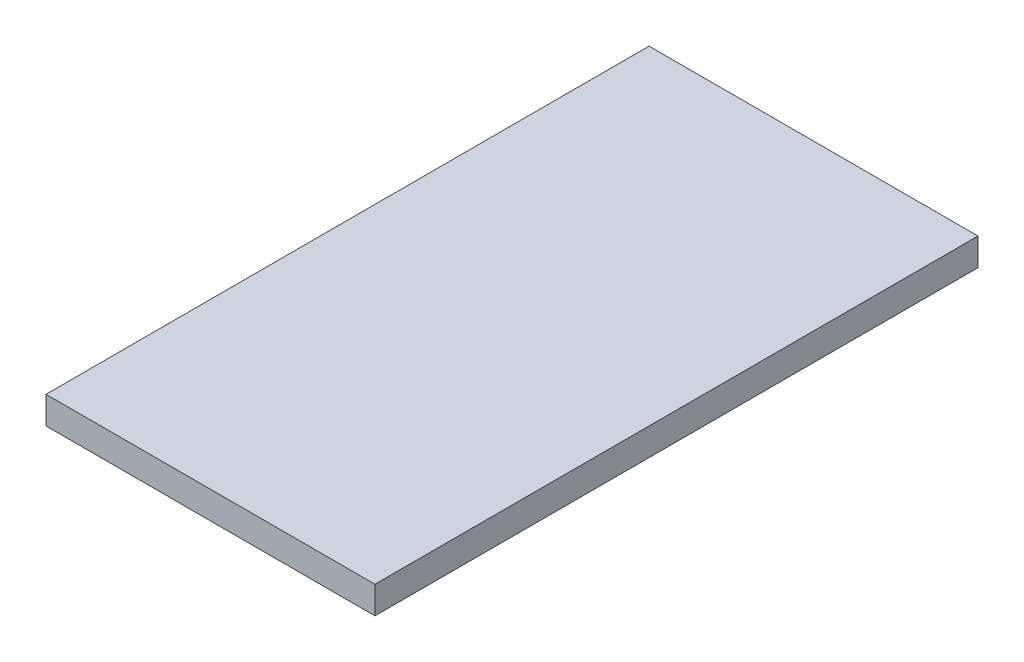
ISO-10303-21;
HEADER;
FILE_DESCRIPTION(('STEP AP214'),'2;1');
FILE_NAME('part.step','',(''),(''),'','','');
FILE_SCHEMA(('AUTOMOTIVE_DESIGN { 1 0 10303 214 1 1 1 1 }'));
ENDSEC;
DATA;
#1=APPLICATION_CONTEXT('core data for automotive mechanical design processes');
#2=APPLICATION_PROTOCOL_DEFINITION('international standard','automotive_design',2000,#1);
#3=PRODUCT_CONTEXT('',#1,'mechanical');
#4=PRODUCT('Part','Part','',(#3));
#5=PRODUCT_RELATED_PRODUCT_CATEGORY('part','',(#4));
#6=PRODUCT_DEFINITION_FORMATION('','',#4);
#7=PRODUCT_DEFINITION_CONTEXT('part definition',#1,'design');
#8=PRODUCT_DEFINITION('design','',#6,#7);
#9=PRODUCT_DEFINITION_SHAPE('','',#8);
#10=(LENGTH_UNIT() NAMED_UNIT(*) SI_UNIT(.MILLI.,.METRE.));
#11=(NAMED_UNIT(*) PLANE_ANGLE_UNIT() SI_UNIT($,.RADIAN.));
#12=(NAMED_UNIT(*) SI_UNIT($,.STERADIAN.) SOLID_ANGLE_UNIT());
#13=UNCERTAINTY_MEASURE_WITH_UNIT(LENGTH_MEASURE(1.E-05),#10,'distance_accuracy_value','');
#14=(GEOMETRIC_REPRESENTATION_CONTEXT(3) GLOBAL_UNCERTAINTY_ASSIGNED_CONTEXT((#13)) GLOBAL_UNIT_ASSIGNED_CONTEXT((#10,
#11,#12)) REPRESENTATION_CONTEXT('',''));
#15=CARTESIAN_POINT('',(0.,0.,0.));
#16=DIRECTION('',(0.,0.,1.));
#17=DIRECTION('',(1.,0.,0.));
#18=AXIS2_PLACEMENT_3D('',#15,#16,#17);
#19=CARTESIAN_POINT('',(0.,6.34999999999999,0.));
#20=DIRECTION('',(1.,0.,0.));
#21=DIRECTION('',(0.,0.,-1.));
#22=AXIS2_PLACEMENT_3D('',#19,#20,#21);
#23=PLANE('',#22);
#24=DIRECTION('',(0.,0.,1.));
#25=VECTOR('',#24,1.);
#26=CARTESIAN_POINT('',(0.,0.,0.));
#27=LINE('',#26,#25);
#28=CARTESIAN_POINT('',(0.,0.,-304.8));
#29=VERTEX_POINT('',#28);
#30=CARTESIAN_POINT('',(0.,0.,-165.1));
#31=VERTEX_POINT('',#30);
#32=EDGE_CURVE('E99',#29,#31,#27,.T.);
#33=ORIENTED_EDGE('',*,*,#32,.T.);
#34=DIRECTION('',(0.,1.,0.));
#35=VECTOR('',#34,1.);
#36=CARTESIAN_POINT('',(0.,0.,-165.1));
#37=LINE('',#36,#35);
#38=CARTESIAN_POINT('',(0.,6.34999999999999,-165.1));
#39=VERTEX_POINT('',#38);
#40=EDGE_CURVE('E48',#31,#39,#37,.T.);
#41=ORIENTED_EDGE('',*,*,#40,.T.);
#42=DIRECTION('',(0.,0.,1.));
#43=VECTOR('',#42,1.);
#44=CARTESIAN_POINT('',(0.,6.34999999999999,0.));
#45=LINE('',#44,#43);
#46=CARTESIAN_POINT('',(0.,6.34999999999999,-304.8));
#47=VERTEX_POINT('',#46);
#48=EDGE_CURVE('E101',#47,#39,#45,.T.);
#49=ORIENTED_EDGE('',*,*,#48,.F.);
#50=DIRECTION('',(0.,-1.,0.));
#51=VECTOR('',#50,1.);
#52=CARTESIAN_POINT('',(0.,6.34999999999999,-304.8));
#53=LINE('',#52,#51);
#54=EDGE_CURVE('E11',#47,#29,#53,.T.);
#55=ORIENTED_EDGE('',*,*,#54,.T.);
#56=EDGE_LOOP('',(#33,#41,#49,#55));
#57=FACE_BOUND('',#56,.T.);
#58=ADVANCED_FACE('F34',(#57),#23,.F.);
#59=CARTESIAN_POINT('',(0.,6.34999999999999,-304.8));
#60=DIRECTION('',(0.,0.,1.));
#61=DIRECTION('',(1.,0.,0.));
#62=AXIS2_PLACEMENT_3D('',#59,#60,#61);
#63=PLANE('',#62);
#64=DIRECTION('',(-1.,0.,0.));
#65=VECTOR('',#64,1.);
#66=CARTESIAN_POINT('',(0.,6.34999999999999,-304.8));
#67=LINE('',#66,#65);
#68=CARTESIAN_POINT('',(76.2,6.35000000000005,-304.8));
#69=VERTEX_POINT('',#68);
#70=EDGE_CURVE('E41',#69,#47,#67,.T.);
#71=ORIENTED_EDGE('',*,*,#70,.F.);
#72=DIRECTION('',(0.,1.,0.));
#73=VECTOR('',#72,1.);
#74=CARTESIAN_POINT('',(76.2,0.,-304.8));
#75=LINE('',#74,#73);
#76=CARTESIAN_POINT('',(76.2,0.,-304.8));
#77=VERTEX_POINT('',#76);
#78=EDGE_CURVE('E97',#77,#69,#75,.T.);
#79=ORIENTED_EDGE('',*,*,#78,.F.);
#80=DIRECTION('',(-1.,0.,0.));
#81=VECTOR('',#80,1.);
#82=CARTESIAN_POINT('',(0.,0.,-304.8));
#83=LINE('',#82,#81);
#84=EDGE_CURVE('E91',#77,#29,#83,.T.);
#85=ORIENTED_EDGE('',*,*,#84,.T.);
#86=ORIENTED_EDGE('',*,*,#54,.F.);
#87=EDGE_LOOP('',(#71,#79,#85,#86));
#88=FACE_BOUND('',#87,.T.);
#89=ADVANCED_FACE('F105',(#88),#63,.F.);
#90=CARTESIAN_POINT('',(0.,6.34999999999999,0.));
#91=DIRECTION('',(0.,-1.,0.));
#92=DIRECTION('',(0.,0.,-1.));
#93=AXIS2_PLACEMENT_3D('',#90,#91,#92);
#94=PLANE('',#93);
#95=DIRECTION('',(-1.,0.,0.));
#96=VECTOR('',#95,1.);
#97=CARTESIAN_POINT('',(76.2,6.35000000000005,-165.1));
#98=LINE('',#97,#96);
#99=CARTESIAN_POINT('',(76.2,6.35000000000005,-165.1));
#100=VERTEX_POINT('',#99);
#101=EDGE_CURVE('E92',#100,#39,#98,.T.);
#102=ORIENTED_EDGE('',*,*,#101,.F.);
#103=DIRECTION('',(0.,0.,1.));
#104=VECTOR('',#103,1.);
#105=CARTESIAN_POINT('',(76.2,6.35000000000005,-304.8));
#106=LINE('',#105,#104);
#107=EDGE_CURVE('E80',#69,#100,#106,.T.);
#108=ORIENTED_EDGE('',*,*,#107,.F.);
#109=ORIENTED_EDGE('',*,*,#70,.T.);
#110=ORIENTED_EDGE('',*,*,#48,.T.);
#111=EDGE_LOOP('',(#102,#108,#109,#110));
#112=FACE_BOUND('',#111,.T.);
#113=ADVANCED_FACE('F108',(#112),#94,.F.);
#114=CARTESIAN_POINT('',(0.,0.,0.));
#115=DIRECTION('',(0.,-1.,0.));
#116=DIRECTION('',(0.,0.,-1.));
#117=AXIS2_PLACEMENT_3D('',#114,#115,#116);
#118=PLANE('',#117);
#119=DIRECTION('',(0.,0.,1.));
#120=VECTOR('',#119,1.);
#121=CARTESIAN_POINT('',(76.2,0.,-304.8));
#122=LINE('',#121,#120);
#123=CARTESIAN_POINT('',(76.2,0.,-165.1));
#124=VERTEX_POINT('',#123);
#125=EDGE_CURVE('E78',#77,#124,#122,.T.);
#126=ORIENTED_EDGE('',*,*,#125,.T.);
#127=DIRECTION('',(-1.,0.,0.));
#128=VECTOR('',#127,1.);
#129=CARTESIAN_POINT('',(76.2,0.,-165.1));
#130=LINE('',#129,#128);
#131=EDGE_CURVE('E82',#124,#31,#130,.T.);
#132=ORIENTED_EDGE('',*,*,#131,.T.);
#133=ORIENTED_EDGE('',*,*,#32,.F.);
#134=ORIENTED_EDGE('',*,*,#84,.F.);
#135=EDGE_LOOP('',(#126,#132,#133,#134));
#136=FACE_BOUND('',#135,.T.);
#137=ADVANCED_FACE('F90',(#136),#118,.T.);
#138=CARTESIAN_POINT('',(76.2,0.,-304.8));
#139=DIRECTION('',(-1.,0.,0.));
#140=DIRECTION('',(0.,0.,1.));
#141=AXIS2_PLACEMENT_3D('',#138,#139,#140);
#142=PLANE('',#141);
#143=ORIENTED_EDGE('',*,*,#107,.T.);
#144=DIRECTION('',(0.,1.,0.));
#145=VECTOR('',#144,1.);
#146=CARTESIAN_POINT('',(76.2,0.,-165.1));
#147=LINE('',#146,#145);
#148=EDGE_CURVE('E75',#124,#100,#147,.T.);
#149=ORIENTED_EDGE('',*,*,#148,.F.);
#150=ORIENTED_EDGE('',*,*,#125,.F.);
#151=ORIENTED_EDGE('',*,*,#78,.T.);
#152=EDGE_LOOP('',(#143,#149,#150,#151));
#153=FACE_BOUND('',#152,.T.);
#154=ADVANCED_FACE('F76',(#153),#142,.F.);
#155=CARTESIAN_POINT('',(76.2,0.,-165.1));
#156=DIRECTION('',(0.,0.,-1.));
#157=DIRECTION('',(-1.,0.,0.));
#158=AXIS2_PLACEMENT_3D('',#155,#156,#157);
#159=PLANE('',#158);
#160=ORIENTED_EDGE('',*,*,#101,.T.);
#161=ORIENTED_EDGE('',*,*,#40,.F.);
#162=ORIENTED_EDGE('',*,*,#131,.F.);
#163=ORIENTED_EDGE('',*,*,#148,.T.);
#164=EDGE_LOOP('',(#160,#161,#162,#163));
#165=FACE_BOUND('',#164,.T.);
#166=ADVANCED_FACE('F84',(#165),#159,.F.);
#167=CLOSED_SHELL('',(#58,#89,#113,#137,#154,#166));
#168=MANIFOLD_SOLID_BREP('B2',#167);
#169=ADVANCED_BREP_SHAPE_REPRESENTATION('',(#18,#168),#14);
#170=SHAPE_DEFINITION_REPRESENTATION(#9,#169);
ENDSEC;
END-ISO-10303-21;
